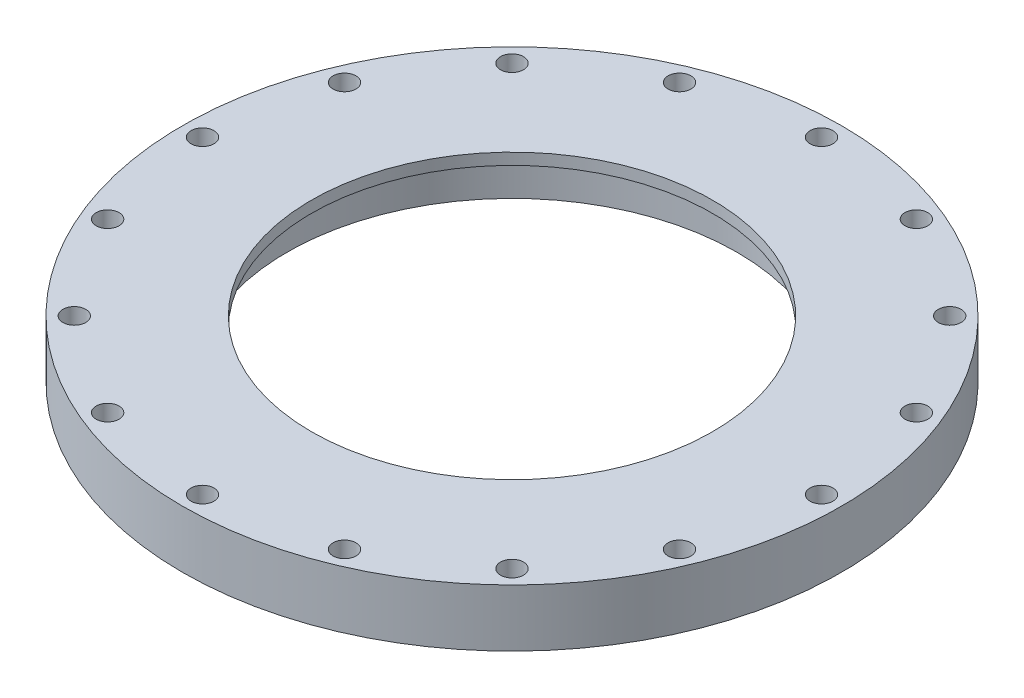
ISO-10303-21;
HEADER;
FILE_DESCRIPTION(('STEP AP214'),'2;1');
FILE_NAME('part.step','',(''),(''),'','','');
FILE_SCHEMA(('AUTOMOTIVE_DESIGN { 1 0 10303 214 1 1 1 1 }'));
ENDSEC;
DATA;
#1=APPLICATION_CONTEXT('core data for automotive mechanical design processes');
#2=APPLICATION_PROTOCOL_DEFINITION('international standard','automotive_design',2000,#1);
#3=PRODUCT_CONTEXT('',#1,'mechanical');
#4=PRODUCT('Part','Part','',(#3));
#5=PRODUCT_RELATED_PRODUCT_CATEGORY('part','',(#4));
#6=PRODUCT_DEFINITION_FORMATION('','',#4);
#7=PRODUCT_DEFINITION_CONTEXT('part definition',#1,'design');
#8=PRODUCT_DEFINITION('design','',#6,#7);
#9=PRODUCT_DEFINITION_SHAPE('','',#8);
#10=(LENGTH_UNIT() NAMED_UNIT(*) SI_UNIT(.MILLI.,.METRE.));
#11=(NAMED_UNIT(*) PLANE_ANGLE_UNIT() SI_UNIT($,.RADIAN.));
#12=(NAMED_UNIT(*) SI_UNIT($,.STERADIAN.) SOLID_ANGLE_UNIT());
#13=UNCERTAINTY_MEASURE_WITH_UNIT(LENGTH_MEASURE(1.E-05),#10,'distance_accuracy_value','');
#14=(GEOMETRIC_REPRESENTATION_CONTEXT(3) GLOBAL_UNCERTAINTY_ASSIGNED_CONTEXT((#13)) GLOBAL_UNIT_ASSIGNED_CONTEXT((#10,
#11,#12)) REPRESENTATION_CONTEXT('',''));
#15=CARTESIAN_POINT('',(0.,0.,0.));
#16=DIRECTION('',(0.,0.,1.));
#17=DIRECTION('',(1.,0.,0.));
#18=AXIS2_PLACEMENT_3D('',#15,#16,#17);
#19=CARTESIAN_POINT('',(0.,0.,0.));
#20=DIRECTION('',(0.,1.,0.));
#21=DIRECTION('',(0.,0.,1.));
#22=AXIS2_PLACEMENT_3D('',#19,#20,#21);
#23=PLANE('',#22);
#24=CARTESIAN_POINT('',(0.,0.,-54.));
#25=DIRECTION('',(0.,1.,0.));
#26=DIRECTION('',(0.,0.,1.));
#27=AXIS2_PLACEMENT_3D('',#24,#25,#26);
#28=CIRCLE('',#27,2.);
#29=CARTESIAN_POINT('',(0.,0.,-52.));
#30=VERTEX_POINT('',#29);
#31=EDGE_CURVE('E57',#30,#30,#28,.T.);
#32=ORIENTED_EDGE('',*,*,#31,.T.);
#33=EDGE_LOOP('',(#32));
#34=FACE_BOUND('',#33,.T.);
#35=CARTESIAN_POINT('',(20.6649053477149,0.,-49.8894947556095));
#36=DIRECTION('',(0.,1.,0.));
#37=DIRECTION('',(0.,0.,1.));
#38=AXIS2_PLACEMENT_3D('',#35,#36,#37);
#39=CIRCLE('',#38,2.);
#40=CARTESIAN_POINT('',(20.6649053477149,0.,-47.8894947556095));
#41=VERTEX_POINT('',#40);
#42=EDGE_CURVE('E62',#41,#41,#39,.T.);
#43=ORIENTED_EDGE('',*,*,#42,.T.);
#44=EDGE_LOOP('',(#43));
#45=FACE_BOUND('',#44,.T.);
#46=CARTESIAN_POINT('',(38.1837661840742,0.,-38.1837661840752));
#47=DIRECTION('',(0.,1.,0.));
#48=DIRECTION('',(0.,0.,1.));
#49=AXIS2_PLACEMENT_3D('',#46,#47,#48);
#50=CIRCLE('',#49,2.);
#51=CARTESIAN_POINT('',(38.1837661840742,0.,-36.1837661840752));
#52=VERTEX_POINT('',#51);
#53=EDGE_CURVE('E65',#52,#52,#50,.T.);
#54=ORIENTED_EDGE('',*,*,#53,.T.);
#55=EDGE_LOOP('',(#54));
#56=FACE_BOUND('',#55,.T.);
#57=CARTESIAN_POINT('',(49.8894947556109,0.,-20.664905347717));
#58=DIRECTION('',(0.,1.,0.));
#59=DIRECTION('',(0.,0.,1.));
#60=AXIS2_PLACEMENT_3D('',#57,#58,#59);
#61=CIRCLE('',#60,2.);
#62=CARTESIAN_POINT('',(49.8894947556109,0.,-18.664905347717));
#63=VERTEX_POINT('',#62);
#64=EDGE_CURVE('E68',#63,#63,#61,.T.);
#65=ORIENTED_EDGE('',*,*,#64,.T.);
#66=EDGE_LOOP('',(#65));
#67=FACE_BOUND('',#66,.T.);
#68=CARTESIAN_POINT('',(54.0000000000023,0.,-2.29223882478963E-12));
#69=DIRECTION('',(0.,1.,0.));
#70=DIRECTION('',(0.,0.,1.));
#71=AXIS2_PLACEMENT_3D('',#68,#69,#70);
#72=CIRCLE('',#71,2.);
#73=CARTESIAN_POINT('',(54.0000000000023,0.,1.99999999999771));
#74=VERTEX_POINT('',#73);
#75=EDGE_CURVE('E71',#74,#74,#72,.T.);
#76=ORIENTED_EDGE('',*,*,#75,.T.);
#77=EDGE_LOOP('',(#76));
#78=FACE_BOUND('',#77,.T.);
#79=CARTESIAN_POINT('',(49.8894947556126,0.,20.6649053477127));
#80=DIRECTION('',(0.,1.,0.));
#81=DIRECTION('',(0.,0.,1.));
#82=AXIS2_PLACEMENT_3D('',#79,#80,#81);
#83=CIRCLE('',#82,2.);
#84=CARTESIAN_POINT('',(49.8894947556126,0.,22.6649053477127));
#85=VERTEX_POINT('',#84);
#86=EDGE_CURVE('E74',#85,#85,#83,.T.);
#87=ORIENTED_EDGE('',*,*,#86,.T.);
#88=EDGE_LOOP('',(#87));
#89=FACE_BOUND('',#88,.T.);
#90=CARTESIAN_POINT('',(38.1837661840775,0.,38.1837661840719));
#91=DIRECTION('',(0.,1.,0.));
#92=DIRECTION('',(0.,0.,1.));
#93=AXIS2_PLACEMENT_3D('',#90,#91,#92);
#94=CIRCLE('',#93,2.);
#95=CARTESIAN_POINT('',(38.1837661840775,0.,40.1837661840719));
#96=VERTEX_POINT('',#95);
#97=EDGE_CURVE('E77',#96,#96,#94,.T.);
#98=ORIENTED_EDGE('',*,*,#97,.T.);
#99=EDGE_LOOP('',(#98));
#100=FACE_BOUND('',#99,.T.);
#101=CARTESIAN_POINT('',(20.6649053477193,0.,49.8894947556086));
#102=DIRECTION('',(0.,1.,0.));
#103=DIRECTION('',(0.,0.,1.));
#104=AXIS2_PLACEMENT_3D('',#101,#102,#103);
#105=CIRCLE('',#104,2.);
#106=CARTESIAN_POINT('',(20.6649053477193,0.,51.8894947556086));
#107=VERTEX_POINT('',#106);
#108=EDGE_CURVE('E80',#107,#107,#105,.T.);
#109=ORIENTED_EDGE('',*,*,#108,.T.);
#110=EDGE_LOOP('',(#109));
#111=FACE_BOUND('',#110,.T.);
#112=CARTESIAN_POINT('',(4.58447764957926E-12,0.,54.));
#113=DIRECTION('',(0.,1.,0.));
#114=DIRECTION('',(0.,0.,1.));
#115=AXIS2_PLACEMENT_3D('',#112,#113,#114);
#116=CIRCLE('',#115,2.);
#117=CARTESIAN_POINT('',(4.58447764957926E-12,0.,56.));
#118=VERTEX_POINT('',#117);
#119=EDGE_CURVE('E83',#118,#118,#116,.T.);
#120=ORIENTED_EDGE('',*,*,#119,.T.);
#121=EDGE_LOOP('',(#120));
#122=FACE_BOUND('',#121,.T.);
#123=CARTESIAN_POINT('',(-20.6649053477104,0.,49.8894947556104));
#124=DIRECTION('',(0.,1.,0.));
#125=DIRECTION('',(0.,0.,1.));
#126=AXIS2_PLACEMENT_3D('',#123,#124,#125);
#127=CIRCLE('',#126,2.);
#128=CARTESIAN_POINT('',(-20.6649053477104,0.,51.8894947556104));
#129=VERTEX_POINT('',#128);
#130=EDGE_CURVE('E86',#129,#129,#127,.T.);
#131=ORIENTED_EDGE('',*,*,#130,.T.);
#132=EDGE_LOOP('',(#131));
#133=FACE_BOUND('',#132,.T.);
#134=CARTESIAN_POINT('',(-38.1837661840697,0.,38.1837661840752));
#135=DIRECTION('',(0.,1.,0.));
#136=DIRECTION('',(0.,0.,1.));
#137=AXIS2_PLACEMENT_3D('',#134,#135,#136);
#138=CIRCLE('',#137,2.);
#139=CARTESIAN_POINT('',(-38.1837661840697,0.,40.1837661840752));
#140=VERTEX_POINT('',#139);
#141=EDGE_CURVE('E89',#140,#140,#138,.T.);
#142=ORIENTED_EDGE('',*,*,#141,.T.);
#143=EDGE_LOOP('',(#142));
#144=FACE_BOUND('',#143,.T.);
#145=CARTESIAN_POINT('',(-49.8894947556063,0.,20.664905347717));
#146=DIRECTION('',(0.,1.,0.));
#147=DIRECTION('',(0.,0.,1.));
#148=AXIS2_PLACEMENT_3D('',#145,#146,#147);
#149=CIRCLE('',#148,2.);
#150=CARTESIAN_POINT('',(-49.8894947556063,0.,22.664905347717));
#151=VERTEX_POINT('',#150);
#152=EDGE_CURVE('E92',#151,#151,#149,.T.);
#153=ORIENTED_EDGE('',*,*,#152,.T.);
#154=EDGE_LOOP('',(#153));
#155=FACE_BOUND('',#154,.T.);
#156=CARTESIAN_POINT('',(-53.9999999999977,0.,2.29885191750503E-12));
#157=DIRECTION('',(0.,1.,0.));
#158=DIRECTION('',(0.,0.,1.));
#159=AXIS2_PLACEMENT_3D('',#156,#157,#158);
#160=CIRCLE('',#159,2.);
#161=CARTESIAN_POINT('',(-53.9999999999977,0.,2.0000000000023));
#162=VERTEX_POINT('',#161);
#163=EDGE_CURVE('E95',#162,#162,#160,.T.);
#164=ORIENTED_EDGE('',*,*,#163,.T.);
#165=EDGE_LOOP('',(#164));
#166=FACE_BOUND('',#165,.T.);
#167=CARTESIAN_POINT('',(-49.8894947556081,0.,-20.6649053477127));
#168=DIRECTION('',(0.,1.,0.));
#169=DIRECTION('',(0.,0.,1.));
#170=AXIS2_PLACEMENT_3D('',#167,#168,#169);
#171=CIRCLE('',#170,2.);
#172=CARTESIAN_POINT('',(-49.8894947556081,0.,-18.6649053477127));
#173=VERTEX_POINT('',#172);
#174=EDGE_CURVE('E98',#173,#173,#171,.T.);
#175=ORIENTED_EDGE('',*,*,#174,.T.);
#176=EDGE_LOOP('',(#175));
#177=FACE_BOUND('',#176,.T.);
#178=CARTESIAN_POINT('',(-38.1837661840729,0.,-38.1837661840719));
#179=DIRECTION('',(0.,1.,0.));
#180=DIRECTION('',(0.,0.,1.));
#181=AXIS2_PLACEMENT_3D('',#178,#179,#180);
#182=CIRCLE('',#181,2.);
#183=CARTESIAN_POINT('',(-38.1837661840729,0.,-36.1837661840719));
#184=VERTEX_POINT('',#183);
#185=EDGE_CURVE('E101',#184,#184,#182,.T.);
#186=ORIENTED_EDGE('',*,*,#185,.T.);
#187=EDGE_LOOP('',(#186));
#188=FACE_BOUND('',#187,.T.);
#189=CARTESIAN_POINT('',(-20.6649053477147,0.,-49.8894947556086));
#190=DIRECTION('',(0.,1.,0.));
#191=DIRECTION('',(0.,0.,1.));
#192=AXIS2_PLACEMENT_3D('',#189,#190,#191);
#193=CIRCLE('',#192,2.);
#194=CARTESIAN_POINT('',(-20.6649053477147,0.,-47.8894947556086));
#195=VERTEX_POINT('',#194);
#196=EDGE_CURVE('E104',#195,#195,#193,.T.);
#197=ORIENTED_EDGE('',*,*,#196,.T.);
#198=EDGE_LOOP('',(#197));
#199=FACE_BOUND('',#198,.T.);
#200=CARTESIAN_POINT('',(0.,0.,0.));
#201=DIRECTION('',(0.,1.,0.));
#202=DIRECTION('',(0.,0.,1.));
#203=AXIS2_PLACEMENT_3D('',#200,#201,#202);
#204=CIRCLE('',#203,57.5);
#205=CARTESIAN_POINT('',(0.,0.,57.5));
#206=VERTEX_POINT('',#205);
#207=EDGE_CURVE('E10',#206,#206,#204,.T.);
#208=ORIENTED_EDGE('',*,*,#207,.F.);
#209=EDGE_LOOP('',(#208));
#210=FACE_BOUND('',#209,.T.);
#211=CARTESIAN_POINT('',(0.,0.,0.));
#212=DIRECTION('',(0.,1.,0.));
#213=DIRECTION('',(0.,0.,1.));
#214=AXIS2_PLACEMENT_3D('',#211,#212,#213);
#215=CIRCLE('',#214,39.25);
#216=CARTESIAN_POINT('',(0.,0.,39.25));
#217=VERTEX_POINT('',#216);
#218=EDGE_CURVE('E40',#217,#217,#215,.T.);
#219=ORIENTED_EDGE('',*,*,#218,.T.);
#220=EDGE_LOOP('',(#219));
#221=FACE_BOUND('',#220,.T.);
#222=ADVANCED_FACE('F33',(#34,#45,#56,#67,#78,#89,#100,#111,#122,#133,#144,#155,#166,#177,#188,
#199,#210,#221),#23,.F.);
#223=CARTESIAN_POINT('',(0.,8.,0.));
#224=DIRECTION('',(0.,-1.,0.));
#225=DIRECTION('',(0.,0.,-1.));
#226=AXIS2_PLACEMENT_3D('',#223,#224,#225);
#227=CYLINDRICAL_SURFACE('',#226,57.5);
#228=ORIENTED_EDGE('',*,*,#207,.T.);
#229=EDGE_LOOP('',(#228));
#230=FACE_BOUND('',#229,.T.);
#231=CARTESIAN_POINT('',(0.,10.,0.));
#232=DIRECTION('',(0.,1.,0.));
#233=DIRECTION('',(0.,0.,1.));
#234=AXIS2_PLACEMENT_3D('',#231,#232,#233);
#235=CIRCLE('',#234,57.5);
#236=CARTESIAN_POINT('',(0.,10.,57.5));
#237=VERTEX_POINT('',#236);
#238=EDGE_CURVE('E48',#237,#237,#235,.T.);
#239=ORIENTED_EDGE('',*,*,#238,.F.);
#240=EDGE_LOOP('',(#239));
#241=FACE_BOUND('',#240,.T.);
#242=ADVANCED_FACE('F35',(#230,#241),#227,.T.);
#243=CARTESIAN_POINT('',(0.,8.,0.));
#244=DIRECTION('',(0.,-1.,0.));
#245=DIRECTION('',(0.,0.,-1.));
#246=AXIS2_PLACEMENT_3D('',#243,#244,#245);
#247=CYLINDRICAL_SURFACE('',#246,39.25);
#248=CARTESIAN_POINT('',(0.,8.,0.));
#249=DIRECTION('',(0.,1.,0.));
#250=DIRECTION('',(0.,0.,1.));
#251=AXIS2_PLACEMENT_3D('',#248,#249,#250);
#252=CIRCLE('',#251,39.25);
#253=CARTESIAN_POINT('',(0.,8.,39.25));
#254=VERTEX_POINT('',#253);
#255=EDGE_CURVE('E44',#254,#254,#252,.T.);
#256=ORIENTED_EDGE('',*,*,#255,.T.);
#257=EDGE_LOOP('',(#256));
#258=FACE_BOUND('',#257,.T.);
#259=ORIENTED_EDGE('',*,*,#218,.F.);
#260=EDGE_LOOP('',(#259));
#261=FACE_BOUND('',#260,.T.);
#262=ADVANCED_FACE('F207',(#258,#261),#247,.F.);
#263=CARTESIAN_POINT('',(0.,8.,0.));
#264=DIRECTION('',(0.,1.,0.));
#265=DIRECTION('',(0.,0.,1.));
#266=AXIS2_PLACEMENT_3D('',#263,#264,#265);
#267=PLANE('',#266);
#268=CARTESIAN_POINT('',(0.,8.,0.));
#269=DIRECTION('',(0.,1.,0.));
#270=DIRECTION('',(0.,0.,1.));
#271=AXIS2_PLACEMENT_3D('',#268,#269,#270);
#272=CIRCLE('',#271,35.);
#273=CARTESIAN_POINT('',(0.,8.,35.));
#274=VERTEX_POINT('',#273);
#275=EDGE_CURVE('E54',#274,#274,#272,.T.);
#276=ORIENTED_EDGE('',*,*,#275,.T.);
#277=EDGE_LOOP('',(#276));
#278=FACE_BOUND('',#277,.T.);
#279=ORIENTED_EDGE('',*,*,#255,.F.);
#280=EDGE_LOOP('',(#279));
#281=FACE_BOUND('',#280,.T.);
#282=ADVANCED_FACE('F163',(#278,#281),#267,.F.);
#283=CARTESIAN_POINT('',(0.,10.,0.));
#284=DIRECTION('',(0.,1.,0.));
#285=DIRECTION('',(0.,0.,1.));
#286=AXIS2_PLACEMENT_3D('',#283,#284,#285);
#287=PLANE('',#286);
#288=CARTESIAN_POINT('',(0.,10.,-54.));
#289=DIRECTION('',(0.,1.,0.));
#290=DIRECTION('',(0.,0.,1.));
#291=AXIS2_PLACEMENT_3D('',#288,#289,#290);
#292=CIRCLE('',#291,2.);
#293=CARTESIAN_POINT('',(0.,10.,-52.));
#294=VERTEX_POINT('',#293);
#295=EDGE_CURVE('E107',#294,#294,#292,.T.);
#296=ORIENTED_EDGE('',*,*,#295,.F.);
#297=EDGE_LOOP('',(#296));
#298=FACE_BOUND('',#297,.T.);
#299=CARTESIAN_POINT('',(20.6649053477149,10.,-49.8894947556095));
#300=DIRECTION('',(0.,1.,0.));
#301=DIRECTION('',(0.,0.,1.));
#302=AXIS2_PLACEMENT_3D('',#299,#300,#301);
#303=CIRCLE('',#302,2.);
#304=CARTESIAN_POINT('',(20.6649053477149,10.,-47.8894947556095));
#305=VERTEX_POINT('',#304);
#306=EDGE_CURVE('E150',#305,#305,#303,.T.);
#307=ORIENTED_EDGE('',*,*,#306,.F.);
#308=EDGE_LOOP('',(#307));
#309=FACE_BOUND('',#308,.T.);
#310=CARTESIAN_POINT('',(38.1837661840742,10.,-38.1837661840752));
#311=DIRECTION('',(0.,1.,0.));
#312=DIRECTION('',(0.,0.,1.));
#313=AXIS2_PLACEMENT_3D('',#310,#311,#312);
#314=CIRCLE('',#313,2.);
#315=CARTESIAN_POINT('',(38.1837661840742,10.,-36.1837661840752));
#316=VERTEX_POINT('',#315);
#317=EDGE_CURVE('E147',#316,#316,#314,.T.);
#318=ORIENTED_EDGE('',*,*,#317,.F.);
#319=EDGE_LOOP('',(#318));
#320=FACE_BOUND('',#319,.T.);
#321=CARTESIAN_POINT('',(49.8894947556109,10.,-20.664905347717));
#322=DIRECTION('',(0.,1.,0.));
#323=DIRECTION('',(0.,0.,1.));
#324=AXIS2_PLACEMENT_3D('',#321,#322,#323);
#325=CIRCLE('',#324,2.);
#326=CARTESIAN_POINT('',(49.8894947556109,10.,-18.664905347717));
#327=VERTEX_POINT('',#326);
#328=EDGE_CURVE('E144',#327,#327,#325,.T.);
#329=ORIENTED_EDGE('',*,*,#328,.F.);
#330=EDGE_LOOP('',(#329));
#331=FACE_BOUND('',#330,.T.);
#332=CARTESIAN_POINT('',(54.0000000000023,10.,-2.29223882478963E-12));
#333=DIRECTION('',(0.,1.,0.));
#334=DIRECTION('',(0.,0.,1.));
#335=AXIS2_PLACEMENT_3D('',#332,#333,#334);
#336=CIRCLE('',#335,2.);
#337=CARTESIAN_POINT('',(54.0000000000023,10.,1.99999999999771));
#338=VERTEX_POINT('',#337);
#339=EDGE_CURVE('E141',#338,#338,#336,.T.);
#340=ORIENTED_EDGE('',*,*,#339,.F.);
#341=EDGE_LOOP('',(#340));
#342=FACE_BOUND('',#341,.T.);
#343=CARTESIAN_POINT('',(49.8894947556126,10.,20.6649053477127));
#344=DIRECTION('',(0.,1.,0.));
#345=DIRECTION('',(0.,0.,1.));
#346=AXIS2_PLACEMENT_3D('',#343,#344,#345);
#347=CIRCLE('',#346,2.);
#348=CARTESIAN_POINT('',(49.8894947556126,10.,22.6649053477127));
#349=VERTEX_POINT('',#348);
#350=EDGE_CURVE('E138',#349,#349,#347,.T.);
#351=ORIENTED_EDGE('',*,*,#350,.F.);
#352=EDGE_LOOP('',(#351));
#353=FACE_BOUND('',#352,.T.);
#354=CARTESIAN_POINT('',(38.1837661840775,10.,38.1837661840719));
#355=DIRECTION('',(0.,1.,0.));
#356=DIRECTION('',(0.,0.,1.));
#357=AXIS2_PLACEMENT_3D('',#354,#355,#356);
#358=CIRCLE('',#357,2.);
#359=CARTESIAN_POINT('',(38.1837661840775,10.,40.1837661840719));
#360=VERTEX_POINT('',#359);
#361=EDGE_CURVE('E135',#360,#360,#358,.T.);
#362=ORIENTED_EDGE('',*,*,#361,.F.);
#363=EDGE_LOOP('',(#362));
#364=FACE_BOUND('',#363,.T.);
#365=CARTESIAN_POINT('',(20.6649053477193,10.,49.8894947556086));
#366=DIRECTION('',(0.,1.,0.));
#367=DIRECTION('',(0.,0.,1.));
#368=AXIS2_PLACEMENT_3D('',#365,#366,#367);
#369=CIRCLE('',#368,2.);
#370=CARTESIAN_POINT('',(20.6649053477193,10.,51.8894947556086));
#371=VERTEX_POINT('',#370);
#372=EDGE_CURVE('E132',#371,#371,#369,.T.);
#373=ORIENTED_EDGE('',*,*,#372,.F.);
#374=EDGE_LOOP('',(#373));
#375=FACE_BOUND('',#374,.T.);
#376=CARTESIAN_POINT('',(4.58447764957926E-12,10.,54.));
#377=DIRECTION('',(0.,1.,0.));
#378=DIRECTION('',(0.,0.,1.));
#379=AXIS2_PLACEMENT_3D('',#376,#377,#378);
#380=CIRCLE('',#379,2.);
#381=CARTESIAN_POINT('',(4.58447764957926E-12,10.,56.));
#382=VERTEX_POINT('',#381);
#383=EDGE_CURVE('E129',#382,#382,#380,.T.);
#384=ORIENTED_EDGE('',*,*,#383,.F.);
#385=EDGE_LOOP('',(#384));
#386=FACE_BOUND('',#385,.T.);
#387=CARTESIAN_POINT('',(-20.6649053477104,10.,49.8894947556104));
#388=DIRECTION('',(0.,1.,0.));
#389=DIRECTION('',(0.,0.,1.));
#390=AXIS2_PLACEMENT_3D('',#387,#388,#389);
#391=CIRCLE('',#390,2.);
#392=CARTESIAN_POINT('',(-20.6649053477104,10.,51.8894947556104));
#393=VERTEX_POINT('',#392);
#394=EDGE_CURVE('E126',#393,#393,#391,.T.);
#395=ORIENTED_EDGE('',*,*,#394,.F.);
#396=EDGE_LOOP('',(#395));
#397=FACE_BOUND('',#396,.T.);
#398=CARTESIAN_POINT('',(-38.1837661840697,10.,38.1837661840752));
#399=DIRECTION('',(0.,1.,0.));
#400=DIRECTION('',(0.,0.,1.));
#401=AXIS2_PLACEMENT_3D('',#398,#399,#400);
#402=CIRCLE('',#401,2.);
#403=CARTESIAN_POINT('',(-38.1837661840697,10.,40.1837661840752));
#404=VERTEX_POINT('',#403);
#405=EDGE_CURVE('E123',#404,#404,#402,.T.);
#406=ORIENTED_EDGE('',*,*,#405,.F.);
#407=EDGE_LOOP('',(#406));
#408=FACE_BOUND('',#407,.T.);
#409=CARTESIAN_POINT('',(-49.8894947556063,10.,20.664905347717));
#410=DIRECTION('',(0.,1.,0.));
#411=DIRECTION('',(0.,0.,1.));
#412=AXIS2_PLACEMENT_3D('',#409,#410,#411);
#413=CIRCLE('',#412,2.);
#414=CARTESIAN_POINT('',(-49.8894947556063,10.,22.664905347717));
#415=VERTEX_POINT('',#414);
#416=EDGE_CURVE('E120',#415,#415,#413,.T.);
#417=ORIENTED_EDGE('',*,*,#416,.F.);
#418=EDGE_LOOP('',(#417));
#419=FACE_BOUND('',#418,.T.);
#420=CARTESIAN_POINT('',(-53.9999999999977,10.,2.29885191750503E-12));
#421=DIRECTION('',(0.,1.,0.));
#422=DIRECTION('',(0.,0.,1.));
#423=AXIS2_PLACEMENT_3D('',#420,#421,#422);
#424=CIRCLE('',#423,2.);
#425=CARTESIAN_POINT('',(-53.9999999999977,10.,2.0000000000023));
#426=VERTEX_POINT('',#425);
#427=EDGE_CURVE('E117',#426,#426,#424,.T.);
#428=ORIENTED_EDGE('',*,*,#427,.F.);
#429=EDGE_LOOP('',(#428));
#430=FACE_BOUND('',#429,.T.);
#431=CARTESIAN_POINT('',(-49.8894947556081,10.,-20.6649053477127));
#432=DIRECTION('',(0.,1.,0.));
#433=DIRECTION('',(0.,0.,1.));
#434=AXIS2_PLACEMENT_3D('',#431,#432,#433);
#435=CIRCLE('',#434,2.);
#436=CARTESIAN_POINT('',(-49.8894947556081,10.,-18.6649053477127));
#437=VERTEX_POINT('',#436);
#438=EDGE_CURVE('E114',#437,#437,#435,.T.);
#439=ORIENTED_EDGE('',*,*,#438,.F.);
#440=EDGE_LOOP('',(#439));
#441=FACE_BOUND('',#440,.T.);
#442=CARTESIAN_POINT('',(-38.1837661840729,10.,-38.1837661840719));
#443=DIRECTION('',(0.,1.,0.));
#444=DIRECTION('',(0.,0.,1.));
#445=AXIS2_PLACEMENT_3D('',#442,#443,#444);
#446=CIRCLE('',#445,2.);
#447=CARTESIAN_POINT('',(-38.1837661840729,10.,-36.1837661840719));
#448=VERTEX_POINT('',#447);
#449=EDGE_CURVE('E111',#448,#448,#446,.T.);
#450=ORIENTED_EDGE('',*,*,#449,.F.);
#451=EDGE_LOOP('',(#450));
#452=FACE_BOUND('',#451,.T.);
#453=CARTESIAN_POINT('',(-20.6649053477147,10.,-49.8894947556086));
#454=DIRECTION('',(0.,1.,0.));
#455=DIRECTION('',(0.,0.,1.));
#456=AXIS2_PLACEMENT_3D('',#453,#454,#455);
#457=CIRCLE('',#456,2.);
#458=CARTESIAN_POINT('',(-20.6649053477147,10.,-47.8894947556086));
#459=VERTEX_POINT('',#458);
#460=EDGE_CURVE('E108',#459,#459,#457,.T.);
#461=ORIENTED_EDGE('',*,*,#460,.F.);
#462=EDGE_LOOP('',(#461));
#463=FACE_BOUND('',#462,.T.);
#464=ORIENTED_EDGE('',*,*,#238,.T.);
#465=EDGE_LOOP('',(#464));
#466=FACE_BOUND('',#465,.T.);
#467=CARTESIAN_POINT('',(0.,10.,0.));
#468=DIRECTION('',(0.,1.,0.));
#469=DIRECTION('',(0.,0.,1.));
#470=AXIS2_PLACEMENT_3D('',#467,#468,#469);
#471=CIRCLE('',#470,35.);
#472=CARTESIAN_POINT('',(0.,10.,35.));
#473=VERTEX_POINT('',#472);
#474=EDGE_CURVE('E53',#473,#473,#471,.T.);
#475=ORIENTED_EDGE('',*,*,#474,.F.);
#476=EDGE_LOOP('',(#475));
#477=FACE_BOUND('',#476,.T.);
#478=ADVANCED_FACE('F159',(#298,#309,#320,#331,#342,#353,#364,#375,#386,#397,#408,#419,#430,
#441,#452,#463,#466,#477),#287,.T.);
#479=CARTESIAN_POINT('',(0.,10.,0.));
#480=DIRECTION('',(0.,-1.,0.));
#481=DIRECTION('',(0.,0.,-1.));
#482=AXIS2_PLACEMENT_3D('',#479,#480,#481);
#483=CYLINDRICAL_SURFACE('',#482,35.);
#484=ORIENTED_EDGE('',*,*,#474,.T.);
#485=EDGE_LOOP('',(#484));
#486=FACE_BOUND('',#485,.T.);
#487=ORIENTED_EDGE('',*,*,#275,.F.);
#488=EDGE_LOOP('',(#487));
#489=FACE_BOUND('',#488,.T.);
#490=ADVANCED_FACE('F162',(#486,#489),#483,.F.);
#491=CARTESIAN_POINT('',(-20.6649053477147,-15.,-49.8894947556086));
#492=DIRECTION('',(0.,1.,0.));
#493=DIRECTION('',(0.,0.,1.));
#494=AXIS2_PLACEMENT_3D('',#491,#492,#493);
#495=CYLINDRICAL_SURFACE('',#494,2.);
#496=ORIENTED_EDGE('',*,*,#460,.T.);
#497=EDGE_LOOP('',(#496));
#498=FACE_BOUND('',#497,.T.);
#499=ORIENTED_EDGE('',*,*,#196,.F.);
#500=EDGE_LOOP('',(#499));
#501=FACE_BOUND('',#500,.T.);
#502=ADVANCED_FACE('F201',(#498,#501),#495,.F.);
#503=CARTESIAN_POINT('',(-38.1837661840729,-15.,-38.1837661840719));
#504=DIRECTION('',(0.,1.,0.));
#505=DIRECTION('',(0.,0.,1.));
#506=AXIS2_PLACEMENT_3D('',#503,#504,#505);
#507=CYLINDRICAL_SURFACE('',#506,2.);
#508=ORIENTED_EDGE('',*,*,#449,.T.);
#509=EDGE_LOOP('',(#508));
#510=FACE_BOUND('',#509,.T.);
#511=ORIENTED_EDGE('',*,*,#185,.F.);
#512=EDGE_LOOP('',(#511));
#513=FACE_BOUND('',#512,.T.);
#514=ADVANCED_FACE('F255',(#510,#513),#507,.F.);
#515=CARTESIAN_POINT('',(-49.8894947556081,-15.,-20.6649053477127));
#516=DIRECTION('',(0.,1.,0.));
#517=DIRECTION('',(0.,0.,1.));
#518=AXIS2_PLACEMENT_3D('',#515,#516,#517);
#519=CYLINDRICAL_SURFACE('',#518,2.);
#520=ORIENTED_EDGE('',*,*,#438,.T.);
#521=EDGE_LOOP('',(#520));
#522=FACE_BOUND('',#521,.T.);
#523=ORIENTED_EDGE('',*,*,#174,.F.);
#524=EDGE_LOOP('',(#523));
#525=FACE_BOUND('',#524,.T.);
#526=ADVANCED_FACE('F261',(#522,#525),#519,.F.);
#527=CARTESIAN_POINT('',(-53.9999999999977,-15.,2.29885191750503E-12));
#528=DIRECTION('',(0.,1.,0.));
#529=DIRECTION('',(0.,0.,1.));
#530=AXIS2_PLACEMENT_3D('',#527,#528,#529);
#531=CYLINDRICAL_SURFACE('',#530,2.);
#532=ORIENTED_EDGE('',*,*,#427,.T.);
#533=EDGE_LOOP('',(#532));
#534=FACE_BOUND('',#533,.T.);
#535=ORIENTED_EDGE('',*,*,#163,.F.);
#536=EDGE_LOOP('',(#535));
#537=FACE_BOUND('',#536,.T.);
#538=ADVANCED_FACE('F267',(#534,#537),#531,.F.);
#539=CARTESIAN_POINT('',(-49.8894947556063,-15.,20.664905347717));
#540=DIRECTION('',(0.,1.,0.));
#541=DIRECTION('',(0.,0.,1.));
#542=AXIS2_PLACEMENT_3D('',#539,#540,#541);
#543=CYLINDRICAL_SURFACE('',#542,2.);
#544=ORIENTED_EDGE('',*,*,#416,.T.);
#545=EDGE_LOOP('',(#544));
#546=FACE_BOUND('',#545,.T.);
#547=ORIENTED_EDGE('',*,*,#152,.F.);
#548=EDGE_LOOP('',(#547));
#549=FACE_BOUND('',#548,.T.);
#550=ADVANCED_FACE('F271',(#546,#549),#543,.F.);
#551=CARTESIAN_POINT('',(-38.1837661840697,-15.,38.1837661840752));
#552=DIRECTION('',(0.,1.,0.));
#553=DIRECTION('',(0.,0.,1.));
#554=AXIS2_PLACEMENT_3D('',#551,#552,#553);
#555=CYLINDRICAL_SURFACE('',#554,2.);
#556=ORIENTED_EDGE('',*,*,#405,.T.);
#557=EDGE_LOOP('',(#556));
#558=FACE_BOUND('',#557,.T.);
#559=ORIENTED_EDGE('',*,*,#141,.F.);
#560=EDGE_LOOP('',(#559));
#561=FACE_BOUND('',#560,.T.);
#562=ADVANCED_FACE('F275',(#558,#561),#555,.F.);
#563=CARTESIAN_POINT('',(-20.6649053477104,-15.,49.8894947556104));
#564=DIRECTION('',(0.,1.,0.));
#565=DIRECTION('',(0.,0.,1.));
#566=AXIS2_PLACEMENT_3D('',#563,#564,#565);
#567=CYLINDRICAL_SURFACE('',#566,2.);
#568=ORIENTED_EDGE('',*,*,#394,.T.);
#569=EDGE_LOOP('',(#568));
#570=FACE_BOUND('',#569,.T.);
#571=ORIENTED_EDGE('',*,*,#130,.F.);
#572=EDGE_LOOP('',(#571));
#573=FACE_BOUND('',#572,.T.);
#574=ADVANCED_FACE('F279',(#570,#573),#567,.F.);
#575=CARTESIAN_POINT('',(4.58447764957926E-12,-15.,54.));
#576=DIRECTION('',(0.,1.,0.));
#577=DIRECTION('',(0.,0.,1.));
#578=AXIS2_PLACEMENT_3D('',#575,#576,#577);
#579=CYLINDRICAL_SURFACE('',#578,2.);
#580=ORIENTED_EDGE('',*,*,#383,.T.);
#581=EDGE_LOOP('',(#580));
#582=FACE_BOUND('',#581,.T.);
#583=ORIENTED_EDGE('',*,*,#119,.F.);
#584=EDGE_LOOP('',(#583));
#585=FACE_BOUND('',#584,.T.);
#586=ADVANCED_FACE('F283',(#582,#585),#579,.F.);
#587=CARTESIAN_POINT('',(20.6649053477193,-15.,49.8894947556086));
#588=DIRECTION('',(0.,1.,0.));
#589=DIRECTION('',(0.,0.,1.));
#590=AXIS2_PLACEMENT_3D('',#587,#588,#589);
#591=CYLINDRICAL_SURFACE('',#590,2.);
#592=ORIENTED_EDGE('',*,*,#372,.T.);
#593=EDGE_LOOP('',(#592));
#594=FACE_BOUND('',#593,.T.);
#595=ORIENTED_EDGE('',*,*,#108,.F.);
#596=EDGE_LOOP('',(#595));
#597=FACE_BOUND('',#596,.T.);
#598=ADVANCED_FACE('F287',(#594,#597),#591,.F.);
#599=CARTESIAN_POINT('',(38.1837661840775,-15.,38.1837661840719));
#600=DIRECTION('',(0.,1.,0.));
#601=DIRECTION('',(0.,0.,1.));
#602=AXIS2_PLACEMENT_3D('',#599,#600,#601);
#603=CYLINDRICAL_SURFACE('',#602,2.);
#604=ORIENTED_EDGE('',*,*,#361,.T.);
#605=EDGE_LOOP('',(#604));
#606=FACE_BOUND('',#605,.T.);
#607=ORIENTED_EDGE('',*,*,#97,.F.);
#608=EDGE_LOOP('',(#607));
#609=FACE_BOUND('',#608,.T.);
#610=ADVANCED_FACE('F291',(#606,#609),#603,.F.);
#611=CARTESIAN_POINT('',(49.8894947556126,-15.,20.6649053477127));
#612=DIRECTION('',(0.,1.,0.));
#613=DIRECTION('',(0.,0.,1.));
#614=AXIS2_PLACEMENT_3D('',#611,#612,#613);
#615=CYLINDRICAL_SURFACE('',#614,2.);
#616=ORIENTED_EDGE('',*,*,#350,.T.);
#617=EDGE_LOOP('',(#616));
#618=FACE_BOUND('',#617,.T.);
#619=ORIENTED_EDGE('',*,*,#86,.F.);
#620=EDGE_LOOP('',(#619));
#621=FACE_BOUND('',#620,.T.);
#622=ADVANCED_FACE('F295',(#618,#621),#615,.F.);
#623=CARTESIAN_POINT('',(54.0000000000023,-15.,-2.29223882478963E-12));
#624=DIRECTION('',(0.,1.,0.));
#625=DIRECTION('',(0.,0.,1.));
#626=AXIS2_PLACEMENT_3D('',#623,#624,#625);
#627=CYLINDRICAL_SURFACE('',#626,2.);
#628=ORIENTED_EDGE('',*,*,#339,.T.);
#629=EDGE_LOOP('',(#628));
#630=FACE_BOUND('',#629,.T.);
#631=ORIENTED_EDGE('',*,*,#75,.F.);
#632=EDGE_LOOP('',(#631));
#633=FACE_BOUND('',#632,.T.);
#634=ADVANCED_FACE('F299',(#630,#633),#627,.F.);
#635=CARTESIAN_POINT('',(49.8894947556109,-15.,-20.664905347717));
#636=DIRECTION('',(0.,1.,0.));
#637=DIRECTION('',(0.,0.,1.));
#638=AXIS2_PLACEMENT_3D('',#635,#636,#637);
#639=CYLINDRICAL_SURFACE('',#638,2.);
#640=ORIENTED_EDGE('',*,*,#328,.T.);
#641=EDGE_LOOP('',(#640));
#642=FACE_BOUND('',#641,.T.);
#643=ORIENTED_EDGE('',*,*,#64,.F.);
#644=EDGE_LOOP('',(#643));
#645=FACE_BOUND('',#644,.T.);
#646=ADVANCED_FACE('F303',(#642,#645),#639,.F.);
#647=CARTESIAN_POINT('',(38.1837661840742,-15.,-38.1837661840752));
#648=DIRECTION('',(0.,1.,0.));
#649=DIRECTION('',(0.,0.,1.));
#650=AXIS2_PLACEMENT_3D('',#647,#648,#649);
#651=CYLINDRICAL_SURFACE('',#650,2.);
#652=ORIENTED_EDGE('',*,*,#317,.T.);
#653=EDGE_LOOP('',(#652));
#654=FACE_BOUND('',#653,.T.);
#655=ORIENTED_EDGE('',*,*,#53,.F.);
#656=EDGE_LOOP('',(#655));
#657=FACE_BOUND('',#656,.T.);
#658=ADVANCED_FACE('F307',(#654,#657),#651,.F.);
#659=CARTESIAN_POINT('',(20.6649053477149,-15.,-49.8894947556095));
#660=DIRECTION('',(0.,1.,0.));
#661=DIRECTION('',(0.,0.,1.));
#662=AXIS2_PLACEMENT_3D('',#659,#660,#661);
#663=CYLINDRICAL_SURFACE('',#662,2.);
#664=ORIENTED_EDGE('',*,*,#306,.T.);
#665=EDGE_LOOP('',(#664));
#666=FACE_BOUND('',#665,.T.);
#667=ORIENTED_EDGE('',*,*,#42,.F.);
#668=EDGE_LOOP('',(#667));
#669=FACE_BOUND('',#668,.T.);
#670=ADVANCED_FACE('F311',(#666,#669),#663,.F.);
#671=CARTESIAN_POINT('',(0.,-15.,-54.));
#672=DIRECTION('',(0.,1.,0.));
#673=DIRECTION('',(0.,0.,1.));
#674=AXIS2_PLACEMENT_3D('',#671,#672,#673);
#675=CYLINDRICAL_SURFACE('',#674,2.);
#676=ORIENTED_EDGE('',*,*,#295,.T.);
#677=EDGE_LOOP('',(#676));
#678=FACE_BOUND('',#677,.T.);
#679=ORIENTED_EDGE('',*,*,#31,.F.);
#680=EDGE_LOOP('',(#679));
#681=FACE_BOUND('',#680,.T.);
#682=ADVANCED_FACE('F156',(#678,#681),#675,.F.);
#683=CLOSED_SHELL('',(#222,#242,#262,#282,#478,#490,#502,#514,#526,#538,#550,#562,#574,#586,
#598,#610,#622,#634,#646,#658,#670,#682));
#684=MANIFOLD_SOLID_BREP('B2',#683);
#685=ADVANCED_BREP_SHAPE_REPRESENTATION('',(#18,#684),#14);
#686=SHAPE_DEFINITION_REPRESENTATION(#9,#685);
ENDSEC;
END-ISO-10303-21;
